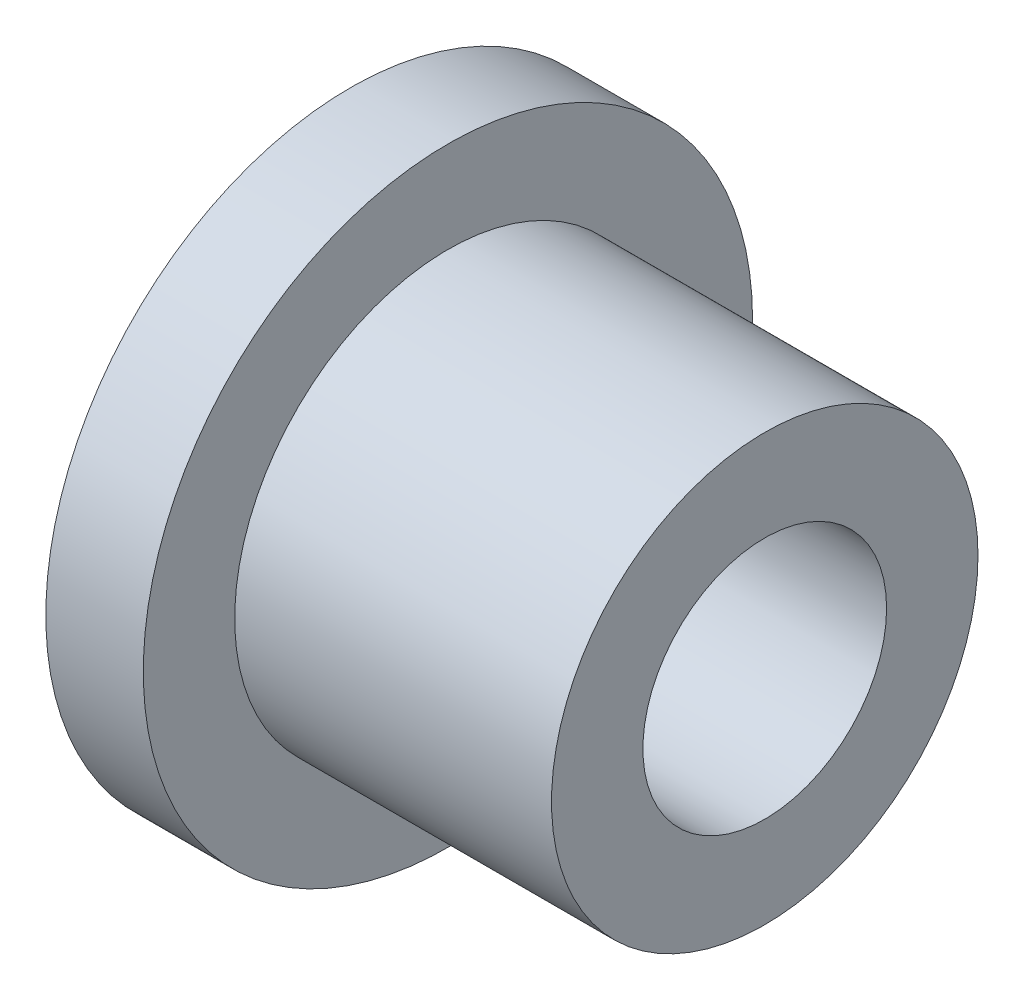
ISO-10303-21;
HEADER;
FILE_DESCRIPTION(('STEP AP214'),'2;1');
FILE_NAME('part.step','',(''),(''),'','','');
FILE_SCHEMA(('AUTOMOTIVE_DESIGN { 1 0 10303 214 1 1 1 1 }'));
ENDSEC;
DATA;
#1=APPLICATION_CONTEXT('core data for automotive mechanical design processes');
#2=APPLICATION_PROTOCOL_DEFINITION('international standard','automotive_design',2000,#1);
#3=PRODUCT_CONTEXT('',#1,'mechanical');
#4=PRODUCT('Part','Part','',(#3));
#5=PRODUCT_RELATED_PRODUCT_CATEGORY('part','',(#4));
#6=PRODUCT_DEFINITION_FORMATION('','',#4);
#7=PRODUCT_DEFINITION_CONTEXT('part definition',#1,'design');
#8=PRODUCT_DEFINITION('design','',#6,#7);
#9=PRODUCT_DEFINITION_SHAPE('','',#8);
#10=(LENGTH_UNIT() NAMED_UNIT(*) SI_UNIT(.MILLI.,.METRE.));
#11=(NAMED_UNIT(*) PLANE_ANGLE_UNIT() SI_UNIT($,.RADIAN.));
#12=(NAMED_UNIT(*) SI_UNIT($,.STERADIAN.) SOLID_ANGLE_UNIT());
#13=UNCERTAINTY_MEASURE_WITH_UNIT(LENGTH_MEASURE(1.E-05),#10,'distance_accuracy_value','');
#14=(GEOMETRIC_REPRESENTATION_CONTEXT(3) GLOBAL_UNCERTAINTY_ASSIGNED_CONTEXT((#13)) GLOBAL_UNIT_ASSIGNED_CONTEXT((#10,
#11,#12)) REPRESENTATION_CONTEXT('',''));
#15=CARTESIAN_POINT('',(0.,0.,0.));
#16=DIRECTION('',(0.,0.,1.));
#17=DIRECTION('',(1.,0.,0.));
#18=AXIS2_PLACEMENT_3D('',#15,#16,#17);
#19=CARTESIAN_POINT('',(0.,0.,0.));
#20=DIRECTION('',(1.,0.,0.));
#21=DIRECTION('',(0.,0.,-1.));
#22=AXIS2_PLACEMENT_3D('',#19,#20,#21);
#23=CYLINDRICAL_SURFACE('',#22,25.);
#24=CARTESIAN_POINT('',(-24.3,0.,0.));
#25=DIRECTION('',(1.,0.,0.));
#26=DIRECTION('',(0.,0.,-1.));
#27=AXIS2_PLACEMENT_3D('',#24,#25,#26);
#28=CIRCLE('',#27,25.);
#29=CARTESIAN_POINT('',(-24.3,0.,-25.));
#30=VERTEX_POINT('',#29);
#31=EDGE_CURVE('E10',#30,#30,#28,.T.);
#32=ORIENTED_EDGE('',*,*,#31,.T.);
#33=EDGE_LOOP('',(#32));
#34=FACE_BOUND('',#33,.T.);
#35=CARTESIAN_POINT('',(-16.3,0.,0.));
#36=DIRECTION('',(1.,0.,0.));
#37=DIRECTION('',(0.,0.,-1.));
#38=AXIS2_PLACEMENT_3D('',#35,#36,#37);
#39=CIRCLE('',#38,25.);
#40=CARTESIAN_POINT('',(-16.3,0.,-25.));
#41=VERTEX_POINT('',#40);
#42=EDGE_CURVE('E64',#41,#41,#39,.T.);
#43=ORIENTED_EDGE('',*,*,#42,.F.);
#44=EDGE_LOOP('',(#43));
#45=FACE_BOUND('',#44,.T.);
#46=ADVANCED_FACE('F37',(#34,#45),#23,.T.);
#47=CARTESIAN_POINT('',(-24.3,25.,0.));
#48=DIRECTION('',(-1.,0.,0.));
#49=DIRECTION('',(0.,0.,1.));
#50=AXIS2_PLACEMENT_3D('',#47,#48,#49);
#51=PLANE('',#50);
#52=CARTESIAN_POINT('',(-24.3,0.,0.));
#53=DIRECTION('',(1.,0.,0.));
#54=DIRECTION('',(0.,0.,-1.));
#55=AXIS2_PLACEMENT_3D('',#52,#53,#54);
#56=CIRCLE('',#55,10.);
#57=CARTESIAN_POINT('',(-24.3,0.,-10.));
#58=VERTEX_POINT('',#57);
#59=EDGE_CURVE('E44',#58,#58,#56,.T.);
#60=ORIENTED_EDGE('',*,*,#59,.T.);
#61=EDGE_LOOP('',(#60));
#62=FACE_BOUND('',#61,.T.);
#63=ORIENTED_EDGE('',*,*,#31,.F.);
#64=EDGE_LOOP('',(#63));
#65=FACE_BOUND('',#64,.T.);
#66=ADVANCED_FACE('F73',(#62,#65),#51,.T.);
#67=CARTESIAN_POINT('',(0.,0.,0.));
#68=DIRECTION('',(1.,0.,0.));
#69=DIRECTION('',(0.,0.,-1.));
#70=AXIS2_PLACEMENT_3D('',#67,#68,#69);
#71=CYLINDRICAL_SURFACE('',#70,10.);
#72=CARTESIAN_POINT('',(9.69999999999999,0.,0.));
#73=DIRECTION('',(1.,0.,0.));
#74=DIRECTION('',(0.,0.,-1.));
#75=AXIS2_PLACEMENT_3D('',#72,#73,#74);
#76=CIRCLE('',#75,10.);
#77=CARTESIAN_POINT('',(9.69999999999999,0.,-10.));
#78=VERTEX_POINT('',#77);
#79=EDGE_CURVE('E49',#78,#78,#76,.T.);
#80=ORIENTED_EDGE('',*,*,#79,.T.);
#81=EDGE_LOOP('',(#80));
#82=FACE_BOUND('',#81,.T.);
#83=ORIENTED_EDGE('',*,*,#59,.F.);
#84=EDGE_LOOP('',(#83));
#85=FACE_BOUND('',#84,.T.);
#86=ADVANCED_FACE('F77',(#82,#85),#71,.F.);
#87=CARTESIAN_POINT('',(9.69999999999999,10.,0.));
#88=DIRECTION('',(1.,0.,0.));
#89=DIRECTION('',(0.,0.,-1.));
#90=AXIS2_PLACEMENT_3D('',#87,#88,#89);
#91=PLANE('',#90);
#92=CARTESIAN_POINT('',(9.69999999999999,0.,0.));
#93=DIRECTION('',(1.,0.,0.));
#94=DIRECTION('',(0.,0.,-1.));
#95=AXIS2_PLACEMENT_3D('',#92,#93,#94);
#96=CIRCLE('',#95,17.5);
#97=CARTESIAN_POINT('',(9.69999999999999,0.,-17.5));
#98=VERTEX_POINT('',#97);
#99=EDGE_CURVE('E54',#98,#98,#96,.T.);
#100=ORIENTED_EDGE('',*,*,#99,.T.);
#101=EDGE_LOOP('',(#100));
#102=FACE_BOUND('',#101,.T.);
#103=ORIENTED_EDGE('',*,*,#79,.F.);
#104=EDGE_LOOP('',(#103));
#105=FACE_BOUND('',#104,.T.);
#106=ADVANCED_FACE('F81',(#102,#105),#91,.T.);
#107=CARTESIAN_POINT('',(0.,0.,0.));
#108=DIRECTION('',(1.,0.,0.));
#109=DIRECTION('',(0.,0.,-1.));
#110=AXIS2_PLACEMENT_3D('',#107,#108,#109);
#111=CYLINDRICAL_SURFACE('',#110,17.5);
#112=CARTESIAN_POINT('',(-16.3,0.,0.));
#113=DIRECTION('',(1.,0.,0.));
#114=DIRECTION('',(0.,0.,-1.));
#115=AXIS2_PLACEMENT_3D('',#112,#113,#114);
#116=CIRCLE('',#115,17.5);
#117=CARTESIAN_POINT('',(-16.3,0.,-17.5));
#118=VERTEX_POINT('',#117);
#119=EDGE_CURVE('E60',#118,#118,#116,.T.);
#120=ORIENTED_EDGE('',*,*,#119,.T.);
#121=EDGE_LOOP('',(#120));
#122=FACE_BOUND('',#121,.T.);
#123=ORIENTED_EDGE('',*,*,#99,.F.);
#124=EDGE_LOOP('',(#123));
#125=FACE_BOUND('',#124,.T.);
#126=ADVANCED_FACE('F88',(#122,#125),#111,.T.);
#127=CARTESIAN_POINT('',(-16.3,17.5,0.));
#128=DIRECTION('',(1.,0.,0.));
#129=DIRECTION('',(0.,0.,-1.));
#130=AXIS2_PLACEMENT_3D('',#127,#128,#129);
#131=PLANE('',#130);
#132=ORIENTED_EDGE('',*,*,#42,.T.);
#133=EDGE_LOOP('',(#132));
#134=FACE_BOUND('',#133,.T.);
#135=ORIENTED_EDGE('',*,*,#119,.F.);
#136=EDGE_LOOP('',(#135));
#137=FACE_BOUND('',#136,.T.);
#138=ADVANCED_FACE('F69',(#134,#137),#131,.T.);
#139=CLOSED_SHELL('',(#46,#66,#86,#106,#126,#138));
#140=MANIFOLD_SOLID_BREP('B2',#139);
#141=ADVANCED_BREP_SHAPE_REPRESENTATION('',(#18,#140),#14);
#142=SHAPE_DEFINITION_REPRESENTATION(#9,#141);
ENDSEC;
END-ISO-10303-21;
